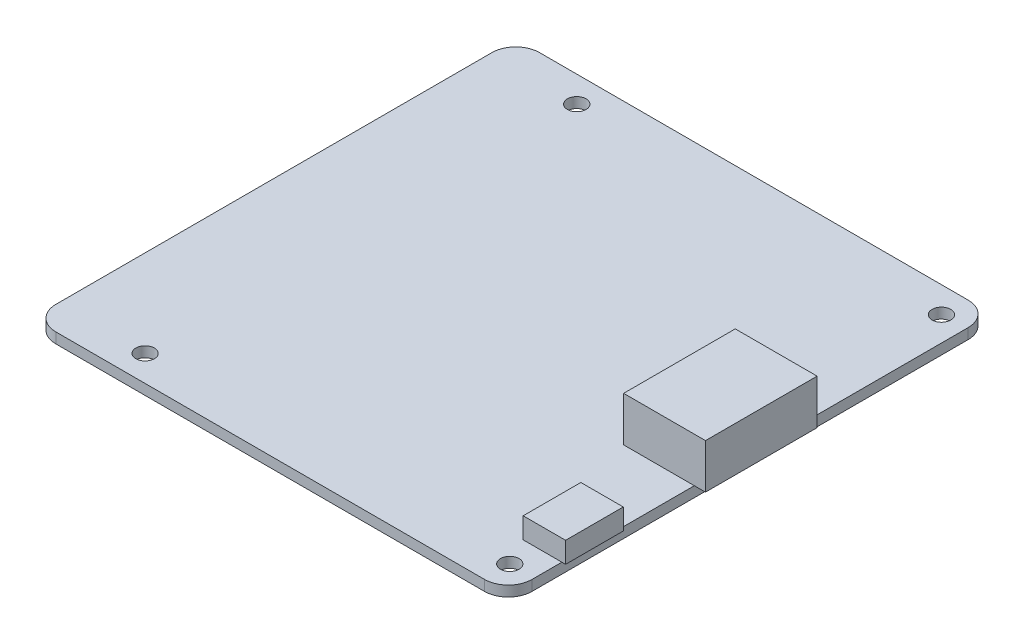
ISO-10303-21;
HEADER;
FILE_DESCRIPTION(('STEP AP214'),'2;1');
FILE_NAME('part.step','',(''),(''),'','','');
FILE_SCHEMA(('AUTOMOTIVE_DESIGN { 1 0 10303 214 1 1 1 1 }'));
ENDSEC;
DATA;
#1=APPLICATION_CONTEXT('core data for automotive mechanical design processes');
#2=APPLICATION_PROTOCOL_DEFINITION('international standard','automotive_design',2000,#1);
#3=PRODUCT_CONTEXT('',#1,'mechanical');
#4=PRODUCT('Part','Part','',(#3));
#5=PRODUCT_RELATED_PRODUCT_CATEGORY('part','',(#4));
#6=PRODUCT_DEFINITION_FORMATION('','',#4);
#7=PRODUCT_DEFINITION_CONTEXT('part definition',#1,'design');
#8=PRODUCT_DEFINITION('design','',#6,#7);
#9=PRODUCT_DEFINITION_SHAPE('','',#8);
#10=(LENGTH_UNIT() NAMED_UNIT(*) SI_UNIT(.MILLI.,.METRE.));
#11=(NAMED_UNIT(*) PLANE_ANGLE_UNIT() SI_UNIT($,.RADIAN.));
#12=(NAMED_UNIT(*) SI_UNIT($,.STERADIAN.) SOLID_ANGLE_UNIT());
#13=UNCERTAINTY_MEASURE_WITH_UNIT(LENGTH_MEASURE(1.E-05),#10,'distance_accuracy_value','');
#14=(GEOMETRIC_REPRESENTATION_CONTEXT(3) GLOBAL_UNCERTAINTY_ASSIGNED_CONTEXT((#13)) GLOBAL_UNIT_ASSIGNED_CONTEXT((#10,
#11,#12)) REPRESENTATION_CONTEXT('',''));
#15=CARTESIAN_POINT('',(0.,0.,0.));
#16=DIRECTION('',(0.,0.,1.));
#17=DIRECTION('',(1.,0.,0.));
#18=AXIS2_PLACEMENT_3D('',#15,#16,#17);
#19=CARTESIAN_POINT('',(0.,1.4,0.));
#20=DIRECTION('',(0.,-1.,0.));
#21=DIRECTION('',(0.,0.,-1.));
#22=AXIS2_PLACEMENT_3D('',#19,#20,#21);
#23=PLANE('',#22);
#24=CARTESIAN_POINT('',(28.7,1.4,29.));
#25=DIRECTION('',(0.,1.,0.));
#26=DIRECTION('',(0.,0.,1.));
#27=AXIS2_PLACEMENT_3D('',#24,#25,#26);
#28=CIRCLE('',#27,1.25);
#29=CARTESIAN_POINT('',(28.7,1.4,30.25));
#30=VERTEX_POINT('',#29);
#31=EDGE_CURVE('E251',#30,#30,#28,.T.);
#32=ORIENTED_EDGE('',*,*,#31,.F.);
#33=EDGE_LOOP('',(#32));
#34=FACE_BOUND('',#33,.T.);
#35=CARTESIAN_POINT('',(-20.3,1.4,29.));
#36=DIRECTION('',(0.,1.,0.));
#37=DIRECTION('',(0.,0.,1.));
#38=AXIS2_PLACEMENT_3D('',#35,#36,#37);
#39=CIRCLE('',#38,1.25);
#40=CARTESIAN_POINT('',(-20.3,1.4,30.25));
#41=VERTEX_POINT('',#40);
#42=EDGE_CURVE('E245',#41,#41,#39,.T.);
#43=ORIENTED_EDGE('',*,*,#42,.F.);
#44=EDGE_LOOP('',(#43));
#45=FACE_BOUND('',#44,.T.);
#46=CARTESIAN_POINT('',(-20.3,1.4,-29.));
#47=DIRECTION('',(0.,1.,0.));
#48=DIRECTION('',(0.,0.,1.));
#49=AXIS2_PLACEMENT_3D('',#46,#47,#48);
#50=CIRCLE('',#49,1.25);
#51=CARTESIAN_POINT('',(-20.3,1.4,-27.75));
#52=VERTEX_POINT('',#51);
#53=EDGE_CURVE('E239',#52,#52,#50,.T.);
#54=ORIENTED_EDGE('',*,*,#53,.F.);
#55=EDGE_LOOP('',(#54));
#56=FACE_BOUND('',#55,.T.);
#57=CARTESIAN_POINT('',(28.7,1.4,-29.));
#58=DIRECTION('',(0.,1.,0.));
#59=DIRECTION('',(0.,0.,1.));
#60=AXIS2_PLACEMENT_3D('',#57,#58,#59);
#61=CIRCLE('',#60,1.25);
#62=CARTESIAN_POINT('',(28.7,1.4,-27.75));
#63=VERTEX_POINT('',#62);
#64=EDGE_CURVE('E233',#63,#63,#61,.T.);
#65=ORIENTED_EDGE('',*,*,#64,.F.);
#66=EDGE_LOOP('',(#65));
#67=FACE_BOUND('',#66,.T.);
#68=DIRECTION('',(-1.,0.,0.));
#69=VECTOR('',#68,1.);
#70=CARTESIAN_POINT('',(-32.,1.4,-32.5));
#71=LINE('',#70,#69);
#72=CARTESIAN_POINT('',(28.8,1.4,-32.5));
#73=VERTEX_POINT('',#72);
#74=CARTESIAN_POINT('',(-28.8,1.4,-32.5));
#75=VERTEX_POINT('',#74);
#76=EDGE_CURVE('E259',#73,#75,#71,.T.);
#77=ORIENTED_EDGE('',*,*,#76,.T.);
#78=CARTESIAN_POINT('',(-28.8,1.4,-29.3));
#79=DIRECTION('',(0.,-1.,0.));
#80=DIRECTION('',(0.,0.,-1.));
#81=AXIS2_PLACEMENT_3D('',#78,#79,#80);
#82=CIRCLE('',#81,3.2);
#83=CARTESIAN_POINT('',(-32.,1.4,-29.3));
#84=VERTEX_POINT('',#83);
#85=EDGE_CURVE('E304',#75,#84,#82,.F.);
#86=ORIENTED_EDGE('',*,*,#85,.T.);
#87=DIRECTION('',(0.,0.,1.));
#88=VECTOR('',#87,1.);
#89=CARTESIAN_POINT('',(-32.,1.4,32.5));
#90=LINE('',#89,#88);
#91=CARTESIAN_POINT('',(-32.,1.4,29.3));
#92=VERTEX_POINT('',#91);
#93=EDGE_CURVE('E265',#84,#92,#90,.T.);
#94=ORIENTED_EDGE('',*,*,#93,.T.);
#95=CARTESIAN_POINT('',(-28.8,1.4,29.3));
#96=DIRECTION('',(0.,-1.,0.));
#97=DIRECTION('',(0.,0.,-1.));
#98=AXIS2_PLACEMENT_3D('',#95,#96,#97);
#99=CIRCLE('',#98,3.2);
#100=CARTESIAN_POINT('',(-28.8,1.4,32.5));
#101=VERTEX_POINT('',#100);
#102=EDGE_CURVE('E299',#92,#101,#99,.F.);
#103=ORIENTED_EDGE('',*,*,#102,.T.);
#104=DIRECTION('',(1.,0.,0.));
#105=VECTOR('',#104,1.);
#106=CARTESIAN_POINT('',(-32.,1.4,32.5));
#107=LINE('',#106,#105);
#108=CARTESIAN_POINT('',(28.8,1.4,32.5));
#109=VERTEX_POINT('',#108);
#110=EDGE_CURVE('E268',#101,#109,#107,.T.);
#111=ORIENTED_EDGE('',*,*,#110,.T.);
#112=CARTESIAN_POINT('',(28.8,1.4,29.3));
#113=DIRECTION('',(0.,-1.,0.));
#114=DIRECTION('',(0.,0.,-1.));
#115=AXIS2_PLACEMENT_3D('',#112,#113,#114);
#116=CIRCLE('',#115,3.2);
#117=CARTESIAN_POINT('',(32.,1.4,29.3));
#118=VERTEX_POINT('',#117);
#119=EDGE_CURVE('E55',#109,#118,#116,.F.);
#120=ORIENTED_EDGE('',*,*,#119,.T.);
#121=DIRECTION('',(0.,0.,-1.));
#122=VECTOR('',#121,1.);
#123=CARTESIAN_POINT('',(32.,1.4,32.5));
#124=LINE('',#123,#122);
#125=CARTESIAN_POINT('',(32.,1.4,25.3));
#126=VERTEX_POINT('',#125);
#127=EDGE_CURVE('E257',#118,#126,#124,.T.);
#128=ORIENTED_EDGE('',*,*,#127,.T.);
#129=DIRECTION('',(1.,0.,0.));
#130=VECTOR('',#129,1.);
#131=CARTESIAN_POINT('',(32.5,1.4,25.3));
#132=LINE('',#131,#130);
#133=CARTESIAN_POINT('',(26.8,1.4,25.3));
#134=VERTEX_POINT('',#133);
#135=EDGE_CURVE('E187',#134,#126,#132,.T.);
#136=ORIENTED_EDGE('',*,*,#135,.F.);
#137=DIRECTION('',(0.,0.,1.));
#138=VECTOR('',#137,1.);
#139=CARTESIAN_POINT('',(26.8,1.4,17.55));
#140=LINE('',#139,#138);
#141=CARTESIAN_POINT('',(26.8,1.4,17.55));
#142=VERTEX_POINT('',#141);
#143=EDGE_CURVE('E333',#142,#134,#140,.T.);
#144=ORIENTED_EDGE('',*,*,#143,.F.);
#145=DIRECTION('',(-1.,0.,0.));
#146=VECTOR('',#145,1.);
#147=CARTESIAN_POINT('',(32.5,1.4,17.55));
#148=LINE('',#147,#146);
#149=CARTESIAN_POINT('',(32.,1.4,17.55));
#150=VERTEX_POINT('',#149);
#151=EDGE_CURVE('E348',#150,#142,#148,.T.);
#152=ORIENTED_EDGE('',*,*,#151,.F.);
#153=CARTESIAN_POINT('',(32.,1.4,7.5));
#154=VERTEX_POINT('',#153);
#155=EDGE_CURVE('E261',#150,#154,#124,.T.);
#156=ORIENTED_EDGE('',*,*,#155,.T.);
#157=DIRECTION('',(1.,0.,0.));
#158=VECTOR('',#157,1.);
#159=CARTESIAN_POINT('',(33.5,1.4,7.5));
#160=LINE('',#159,#158);
#161=CARTESIAN_POINT('',(22.5,1.4,7.5));
#162=VERTEX_POINT('',#161);
#163=EDGE_CURVE('E205',#162,#154,#160,.T.);
#164=ORIENTED_EDGE('',*,*,#163,.F.);
#165=DIRECTION('',(0.,0.,1.));
#166=VECTOR('',#165,1.);
#167=CARTESIAN_POINT('',(22.5,1.4,-7.5));
#168=LINE('',#167,#166);
#169=CARTESIAN_POINT('',(22.5,1.4,-7.5));
#170=VERTEX_POINT('',#169);
#171=EDGE_CURVE('E214',#170,#162,#168,.T.);
#172=ORIENTED_EDGE('',*,*,#171,.F.);
#173=DIRECTION('',(-1.,0.,0.));
#174=VECTOR('',#173,1.);
#175=CARTESIAN_POINT('',(33.5,1.4,-7.5));
#176=LINE('',#175,#174);
#177=CARTESIAN_POINT('',(32.,1.4,-7.5));
#178=VERTEX_POINT('',#177);
#179=EDGE_CURVE('E215',#178,#170,#176,.T.);
#180=ORIENTED_EDGE('',*,*,#179,.F.);
#181=CARTESIAN_POINT('',(32.,1.4,-29.3));
#182=VERTEX_POINT('',#181);
#183=EDGE_CURVE('E280',#178,#182,#124,.T.);
#184=ORIENTED_EDGE('',*,*,#183,.T.);
#185=CARTESIAN_POINT('',(28.8,1.4,-29.3));
#186=DIRECTION('',(0.,-1.,0.));
#187=DIRECTION('',(0.,0.,-1.));
#188=AXIS2_PLACEMENT_3D('',#185,#186,#187);
#189=CIRCLE('',#188,3.2);
#190=EDGE_CURVE('E302',#182,#73,#189,.F.);
#191=ORIENTED_EDGE('',*,*,#190,.T.);
#192=EDGE_LOOP('',(#77,#86,#94,#103,#111,#120,#128,#136,#144,#152,#156,#164,#172,#180,#184,#191));
#193=FACE_BOUND('',#192,.T.);
#194=ADVANCED_FACE('F40',(#34,#45,#56,#67,#193),#23,.F.);
#195=CARTESIAN_POINT('',(0.,0.,0.));
#196=DIRECTION('',(0.,-1.,0.));
#197=DIRECTION('',(0.,0.,-1.));
#198=AXIS2_PLACEMENT_3D('',#195,#196,#197);
#199=PLANE('',#198);
#200=CARTESIAN_POINT('',(-20.3,0.,-29.));
#201=DIRECTION('',(0.,1.,0.));
#202=DIRECTION('',(0.,0.,1.));
#203=AXIS2_PLACEMENT_3D('',#200,#201,#202);
#204=CIRCLE('',#203,1.25);
#205=CARTESIAN_POINT('',(-20.3,0.,-27.75));
#206=VERTEX_POINT('',#205);
#207=EDGE_CURVE('E236',#206,#206,#204,.T.);
#208=ORIENTED_EDGE('',*,*,#207,.T.);
#209=EDGE_LOOP('',(#208));
#210=FACE_BOUND('',#209,.T.);
#211=CARTESIAN_POINT('',(28.7,0.,29.));
#212=DIRECTION('',(0.,1.,0.));
#213=DIRECTION('',(0.,0.,1.));
#214=AXIS2_PLACEMENT_3D('',#211,#212,#213);
#215=CIRCLE('',#214,1.25);
#216=CARTESIAN_POINT('',(28.7,0.,30.25));
#217=VERTEX_POINT('',#216);
#218=EDGE_CURVE('E248',#217,#217,#215,.T.);
#219=ORIENTED_EDGE('',*,*,#218,.T.);
#220=EDGE_LOOP('',(#219));
#221=FACE_BOUND('',#220,.T.);
#222=DIRECTION('',(0.,0.,1.));
#223=VECTOR('',#222,1.);
#224=CARTESIAN_POINT('',(-32.,0.,32.5));
#225=LINE('',#224,#223);
#226=CARTESIAN_POINT('',(-32.,0.,-29.3));
#227=VERTEX_POINT('',#226);
#228=CARTESIAN_POINT('',(-32.,0.,29.3));
#229=VERTEX_POINT('',#228);
#230=EDGE_CURVE('E275',#227,#229,#225,.T.);
#231=ORIENTED_EDGE('',*,*,#230,.F.);
#232=CARTESIAN_POINT('',(-28.8,0.,-29.3));
#233=DIRECTION('',(0.,-1.,0.));
#234=DIRECTION('',(0.,0.,-1.));
#235=AXIS2_PLACEMENT_3D('',#232,#233,#234);
#236=CIRCLE('',#235,3.2);
#237=CARTESIAN_POINT('',(-28.8,0.,-32.5));
#238=VERTEX_POINT('',#237);
#239=EDGE_CURVE('E292',#227,#238,#236,.T.);
#240=ORIENTED_EDGE('',*,*,#239,.T.);
#241=DIRECTION('',(-1.,0.,0.));
#242=VECTOR('',#241,1.);
#243=CARTESIAN_POINT('',(-32.,0.,-32.5));
#244=LINE('',#243,#242);
#245=CARTESIAN_POINT('',(28.8,0.,-32.5));
#246=VERTEX_POINT('',#245);
#247=EDGE_CURVE('E272',#246,#238,#244,.T.);
#248=ORIENTED_EDGE('',*,*,#247,.F.);
#249=CARTESIAN_POINT('',(28.8,0.,-29.3));
#250=DIRECTION('',(0.,-1.,0.));
#251=DIRECTION('',(0.,0.,-1.));
#252=AXIS2_PLACEMENT_3D('',#249,#250,#251);
#253=CIRCLE('',#252,3.2);
#254=CARTESIAN_POINT('',(32.,0.,-29.3));
#255=VERTEX_POINT('',#254);
#256=EDGE_CURVE('E290',#246,#255,#253,.T.);
#257=ORIENTED_EDGE('',*,*,#256,.T.);
#258=DIRECTION('',(0.,0.,-1.));
#259=VECTOR('',#258,1.);
#260=CARTESIAN_POINT('',(32.,0.,32.5));
#261=LINE('',#260,#259);
#262=CARTESIAN_POINT('',(32.,0.,29.3));
#263=VERTEX_POINT('',#262);
#264=EDGE_CURVE('E254',#263,#255,#261,.T.);
#265=ORIENTED_EDGE('',*,*,#264,.F.);
#266=CARTESIAN_POINT('',(28.8,0.,29.3));
#267=DIRECTION('',(0.,-1.,0.));
#268=DIRECTION('',(0.,0.,-1.));
#269=AXIS2_PLACEMENT_3D('',#266,#267,#268);
#270=CIRCLE('',#269,3.2);
#271=CARTESIAN_POINT('',(28.8,0.,32.5));
#272=VERTEX_POINT('',#271);
#273=EDGE_CURVE('E288',#263,#272,#270,.T.);
#274=ORIENTED_EDGE('',*,*,#273,.T.);
#275=DIRECTION('',(1.,0.,0.));
#276=VECTOR('',#275,1.);
#277=CARTESIAN_POINT('',(-32.,0.,32.5));
#278=LINE('',#277,#276);
#279=CARTESIAN_POINT('',(-28.8,0.,32.5));
#280=VERTEX_POINT('',#279);
#281=EDGE_CURVE('E278',#280,#272,#278,.T.);
#282=ORIENTED_EDGE('',*,*,#281,.F.);
#283=CARTESIAN_POINT('',(-28.8,0.,29.3));
#284=DIRECTION('',(0.,-1.,0.));
#285=DIRECTION('',(0.,0.,-1.));
#286=AXIS2_PLACEMENT_3D('',#283,#284,#285);
#287=CIRCLE('',#286,3.2);
#288=EDGE_CURVE('E286',#280,#229,#287,.T.);
#289=ORIENTED_EDGE('',*,*,#288,.T.);
#290=EDGE_LOOP('',(#231,#240,#248,#257,#265,#274,#282,#289));
#291=FACE_BOUND('',#290,.T.);
#292=CARTESIAN_POINT('',(-20.3,0.,29.));
#293=DIRECTION('',(0.,1.,0.));
#294=DIRECTION('',(0.,0.,1.));
#295=AXIS2_PLACEMENT_3D('',#292,#293,#294);
#296=CIRCLE('',#295,1.25);
#297=CARTESIAN_POINT('',(-20.3,0.,30.25));
#298=VERTEX_POINT('',#297);
#299=EDGE_CURVE('E242',#298,#298,#296,.T.);
#300=ORIENTED_EDGE('',*,*,#299,.T.);
#301=EDGE_LOOP('',(#300));
#302=FACE_BOUND('',#301,.T.);
#303=CARTESIAN_POINT('',(28.7,0.,-29.));
#304=DIRECTION('',(0.,1.,0.));
#305=DIRECTION('',(0.,0.,1.));
#306=AXIS2_PLACEMENT_3D('',#303,#304,#305);
#307=CIRCLE('',#306,1.25);
#308=CARTESIAN_POINT('',(28.7,0.,-27.75));
#309=VERTEX_POINT('',#308);
#310=EDGE_CURVE('E232',#309,#309,#307,.T.);
#311=ORIENTED_EDGE('',*,*,#310,.T.);
#312=EDGE_LOOP('',(#311));
#313=FACE_BOUND('',#312,.T.);
#314=ADVANCED_FACE('F318',(#210,#221,#291,#302,#313),#199,.T.);
#315=CARTESIAN_POINT('',(32.,1.4,32.5));
#316=DIRECTION('',(-1.,0.,0.));
#317=DIRECTION('',(0.,0.,1.));
#318=AXIS2_PLACEMENT_3D('',#315,#316,#317);
#319=PLANE('',#318);
#320=ORIENTED_EDGE('',*,*,#264,.T.);
#321=DIRECTION('',(0.,-1.,0.));
#322=VECTOR('',#321,1.);
#323=CARTESIAN_POINT('',(32.,1.4,-29.3));
#324=LINE('',#323,#322);
#325=EDGE_CURVE('E309',#255,#182,#324,.F.);
#326=ORIENTED_EDGE('',*,*,#325,.T.);
#327=ORIENTED_EDGE('',*,*,#183,.F.);
#328=EDGE_CURVE('E262',#154,#178,#124,.T.);
#329=ORIENTED_EDGE('',*,*,#328,.F.);
#330=ORIENTED_EDGE('',*,*,#155,.F.);
#331=EDGE_CURVE('E260',#126,#150,#124,.T.);
#332=ORIENTED_EDGE('',*,*,#331,.F.);
#333=ORIENTED_EDGE('',*,*,#127,.F.);
#334=DIRECTION('',(0.,-1.,0.));
#335=VECTOR('',#334,1.);
#336=CARTESIAN_POINT('',(32.,1.4,29.3));
#337=LINE('',#336,#335);
#338=EDGE_CURVE('E306',#118,#263,#337,.T.);
#339=ORIENTED_EDGE('',*,*,#338,.T.);
#340=EDGE_LOOP('',(#320,#326,#327,#329,#330,#332,#333,#339));
#341=FACE_BOUND('',#340,.T.);
#342=ADVANCED_FACE('F325',(#341),#319,.F.);
#343=CARTESIAN_POINT('',(-32.,1.4,-32.5));
#344=DIRECTION('',(0.,0.,1.));
#345=DIRECTION('',(1.,0.,0.));
#346=AXIS2_PLACEMENT_3D('',#343,#344,#345);
#347=PLANE('',#346);
#348=ORIENTED_EDGE('',*,*,#247,.T.);
#349=DIRECTION('',(0.,-1.,0.));
#350=VECTOR('',#349,1.);
#351=CARTESIAN_POINT('',(-28.8,1.4,-32.5));
#352=LINE('',#351,#350);
#353=EDGE_CURVE('E297',#238,#75,#352,.F.);
#354=ORIENTED_EDGE('',*,*,#353,.T.);
#355=ORIENTED_EDGE('',*,*,#76,.F.);
#356=DIRECTION('',(0.,-1.,0.));
#357=VECTOR('',#356,1.);
#358=CARTESIAN_POINT('',(28.8,1.4,-32.5));
#359=LINE('',#358,#357);
#360=EDGE_CURVE('E294',#73,#246,#359,.T.);
#361=ORIENTED_EDGE('',*,*,#360,.T.);
#362=EDGE_LOOP('',(#348,#354,#355,#361));
#363=FACE_BOUND('',#362,.T.);
#364=ADVANCED_FACE('F408',(#363),#347,.F.);
#365=CARTESIAN_POINT('',(-32.,1.4,32.5));
#366=DIRECTION('',(1.,0.,0.));
#367=DIRECTION('',(0.,0.,-1.));
#368=AXIS2_PLACEMENT_3D('',#365,#366,#367);
#369=PLANE('',#368);
#370=ORIENTED_EDGE('',*,*,#93,.F.);
#371=DIRECTION('',(0.,-1.,0.));
#372=VECTOR('',#371,1.);
#373=CARTESIAN_POINT('',(-32.,1.4,-29.3));
#374=LINE('',#373,#372);
#375=EDGE_CURVE('E283',#84,#227,#374,.T.);
#376=ORIENTED_EDGE('',*,*,#375,.T.);
#377=ORIENTED_EDGE('',*,*,#230,.T.);
#378=DIRECTION('',(0.,-1.,0.));
#379=VECTOR('',#378,1.);
#380=CARTESIAN_POINT('',(-32.,1.4,29.3));
#381=LINE('',#380,#379);
#382=EDGE_CURVE('E281',#229,#92,#381,.F.);
#383=ORIENTED_EDGE('',*,*,#382,.T.);
#384=EDGE_LOOP('',(#370,#376,#377,#383));
#385=FACE_BOUND('',#384,.T.);
#386=ADVANCED_FACE('F405',(#385),#369,.F.);
#387=CARTESIAN_POINT('',(-32.,1.4,32.5));
#388=DIRECTION('',(0.,0.,-1.));
#389=DIRECTION('',(-1.,0.,0.));
#390=AXIS2_PLACEMENT_3D('',#387,#388,#389);
#391=PLANE('',#390);
#392=ORIENTED_EDGE('',*,*,#281,.T.);
#393=DIRECTION('',(0.,-1.,0.));
#394=VECTOR('',#393,1.);
#395=CARTESIAN_POINT('',(28.8,1.4,32.5));
#396=LINE('',#395,#394);
#397=EDGE_CURVE('E11',#272,#109,#396,.F.);
#398=ORIENTED_EDGE('',*,*,#397,.T.);
#399=ORIENTED_EDGE('',*,*,#110,.F.);
#400=DIRECTION('',(0.,-1.,0.));
#401=VECTOR('',#400,1.);
#402=CARTESIAN_POINT('',(-28.8,1.4,32.5));
#403=LINE('',#402,#401);
#404=EDGE_CURVE('E48',#101,#280,#403,.T.);
#405=ORIENTED_EDGE('',*,*,#404,.T.);
#406=EDGE_LOOP('',(#392,#398,#399,#405));
#407=FACE_BOUND('',#406,.T.);
#408=ADVANCED_FACE('F313',(#407),#391,.F.);
#409=CARTESIAN_POINT('',(28.7,1.4,29.));
#410=DIRECTION('',(0.,-1.,0.));
#411=DIRECTION('',(0.,0.,-1.));
#412=AXIS2_PLACEMENT_3D('',#409,#410,#411);
#413=CYLINDRICAL_SURFACE('',#412,1.25);
#414=ORIENTED_EDGE('',*,*,#31,.T.);
#415=EDGE_LOOP('',(#414));
#416=FACE_BOUND('',#415,.T.);
#417=ORIENTED_EDGE('',*,*,#218,.F.);
#418=EDGE_LOOP('',(#417));
#419=FACE_BOUND('',#418,.T.);
#420=ADVANCED_FACE('F400',(#416,#419),#413,.F.);
#421=CARTESIAN_POINT('',(-20.3,1.4,29.));
#422=DIRECTION('',(0.,-1.,0.));
#423=DIRECTION('',(0.,0.,-1.));
#424=AXIS2_PLACEMENT_3D('',#421,#422,#423);
#425=CYLINDRICAL_SURFACE('',#424,1.25);
#426=ORIENTED_EDGE('',*,*,#42,.T.);
#427=EDGE_LOOP('',(#426));
#428=FACE_BOUND('',#427,.T.);
#429=ORIENTED_EDGE('',*,*,#299,.F.);
#430=EDGE_LOOP('',(#429));
#431=FACE_BOUND('',#430,.T.);
#432=ADVANCED_FACE('F460',(#428,#431),#425,.F.);
#433=CARTESIAN_POINT('',(-20.3,1.4,-29.));
#434=DIRECTION('',(0.,-1.,0.));
#435=DIRECTION('',(0.,0.,-1.));
#436=AXIS2_PLACEMENT_3D('',#433,#434,#435);
#437=CYLINDRICAL_SURFACE('',#436,1.25);
#438=ORIENTED_EDGE('',*,*,#53,.T.);
#439=EDGE_LOOP('',(#438));
#440=FACE_BOUND('',#439,.T.);
#441=ORIENTED_EDGE('',*,*,#207,.F.);
#442=EDGE_LOOP('',(#441));
#443=FACE_BOUND('',#442,.T.);
#444=ADVANCED_FACE('F454',(#440,#443),#437,.F.);
#445=CARTESIAN_POINT('',(28.7,1.4,-29.));
#446=DIRECTION('',(0.,-1.,0.));
#447=DIRECTION('',(0.,0.,-1.));
#448=AXIS2_PLACEMENT_3D('',#445,#446,#447);
#449=CYLINDRICAL_SURFACE('',#448,1.25);
#450=ORIENTED_EDGE('',*,*,#64,.T.);
#451=EDGE_LOOP('',(#450));
#452=FACE_BOUND('',#451,.T.);
#453=ORIENTED_EDGE('',*,*,#310,.F.);
#454=EDGE_LOOP('',(#453));
#455=FACE_BOUND('',#454,.T.);
#456=ADVANCED_FACE('F459',(#452,#455),#449,.F.);
#457=CARTESIAN_POINT('',(33.5,7.4,-7.5));
#458=DIRECTION('',(-1.,0.,0.));
#459=DIRECTION('',(0.,0.,1.));
#460=AXIS2_PLACEMENT_3D('',#457,#458,#459);
#461=PLANE('',#460);
#462=DIRECTION('',(0.,0.,-1.));
#463=VECTOR('',#462,1.);
#464=CARTESIAN_POINT('',(33.5,1.4,-7.5));
#465=LINE('',#464,#463);
#466=CARTESIAN_POINT('',(33.5,1.4,7.5));
#467=VERTEX_POINT('',#466);
#468=CARTESIAN_POINT('',(33.5,1.4,-7.5));
#469=VERTEX_POINT('',#468);
#470=EDGE_CURVE('E192',#467,#469,#465,.T.);
#471=ORIENTED_EDGE('',*,*,#470,.T.);
#472=DIRECTION('',(0.,-1.,0.));
#473=VECTOR('',#472,1.);
#474=CARTESIAN_POINT('',(33.5,7.4,-7.5));
#475=LINE('',#474,#473);
#476=CARTESIAN_POINT('',(33.5,7.4,-7.5));
#477=VERTEX_POINT('',#476);
#478=EDGE_CURVE('E229',#477,#469,#475,.T.);
#479=ORIENTED_EDGE('',*,*,#478,.F.);
#480=DIRECTION('',(0.,0.,-1.));
#481=VECTOR('',#480,1.);
#482=CARTESIAN_POINT('',(33.5,7.4,-7.5));
#483=LINE('',#482,#481);
#484=CARTESIAN_POINT('',(33.5,7.4,7.5));
#485=VERTEX_POINT('',#484);
#486=EDGE_CURVE('E201',#485,#477,#483,.T.);
#487=ORIENTED_EDGE('',*,*,#486,.F.);
#488=DIRECTION('',(0.,-1.,0.));
#489=VECTOR('',#488,1.);
#490=CARTESIAN_POINT('',(33.5,7.4,7.5));
#491=LINE('',#490,#489);
#492=EDGE_CURVE('E210',#485,#467,#491,.T.);
#493=ORIENTED_EDGE('',*,*,#492,.T.);
#494=EDGE_LOOP('',(#471,#479,#487,#493));
#495=FACE_BOUND('',#494,.T.);
#496=ADVANCED_FACE('F369',(#495),#461,.F.);
#497=CARTESIAN_POINT('',(33.5,7.4,-7.5));
#498=DIRECTION('',(0.,0.,1.));
#499=DIRECTION('',(1.,0.,0.));
#500=AXIS2_PLACEMENT_3D('',#497,#498,#499);
#501=PLANE('',#500);
#502=EDGE_CURVE('E195',#469,#178,#176,.T.);
#503=ORIENTED_EDGE('',*,*,#502,.T.);
#504=ORIENTED_EDGE('',*,*,#179,.T.);
#505=DIRECTION('',(0.,-1.,0.));
#506=VECTOR('',#505,1.);
#507=CARTESIAN_POINT('',(22.5,7.4,-7.5));
#508=LINE('',#507,#506);
#509=CARTESIAN_POINT('',(22.5,7.4,-7.5));
#510=VERTEX_POINT('',#509);
#511=EDGE_CURVE('E226',#510,#170,#508,.T.);
#512=ORIENTED_EDGE('',*,*,#511,.F.);
#513=DIRECTION('',(-1.,0.,0.));
#514=VECTOR('',#513,1.);
#515=CARTESIAN_POINT('',(33.5,7.4,-7.5));
#516=LINE('',#515,#514);
#517=EDGE_CURVE('E204',#477,#510,#516,.T.);
#518=ORIENTED_EDGE('',*,*,#517,.F.);
#519=ORIENTED_EDGE('',*,*,#478,.T.);
#520=EDGE_LOOP('',(#503,#504,#512,#518,#519));
#521=FACE_BOUND('',#520,.T.);
#522=ADVANCED_FACE('F364',(#521),#501,.F.);
#523=CARTESIAN_POINT('',(22.5,7.4,-7.5));
#524=DIRECTION('',(1.,0.,0.));
#525=DIRECTION('',(0.,0.,-1.));
#526=AXIS2_PLACEMENT_3D('',#523,#524,#525);
#527=PLANE('',#526);
#528=ORIENTED_EDGE('',*,*,#171,.T.);
#529=DIRECTION('',(0.,-1.,0.));
#530=VECTOR('',#529,1.);
#531=CARTESIAN_POINT('',(22.5,7.4,7.5));
#532=LINE('',#531,#530);
#533=CARTESIAN_POINT('',(22.5,7.4,7.5));
#534=VERTEX_POINT('',#533);
#535=EDGE_CURVE('E223',#534,#162,#532,.T.);
#536=ORIENTED_EDGE('',*,*,#535,.F.);
#537=DIRECTION('',(0.,0.,1.));
#538=VECTOR('',#537,1.);
#539=CARTESIAN_POINT('',(22.5,7.4,-7.5));
#540=LINE('',#539,#538);
#541=EDGE_CURVE('E207',#510,#534,#540,.T.);
#542=ORIENTED_EDGE('',*,*,#541,.F.);
#543=ORIENTED_EDGE('',*,*,#511,.T.);
#544=EDGE_LOOP('',(#528,#536,#542,#543));
#545=FACE_BOUND('',#544,.T.);
#546=ADVANCED_FACE('F376',(#545),#527,.F.);
#547=CARTESIAN_POINT('',(33.5,7.4,7.5));
#548=DIRECTION('',(0.,0.,-1.));
#549=DIRECTION('',(-1.,0.,0.));
#550=AXIS2_PLACEMENT_3D('',#547,#548,#549);
#551=PLANE('',#550);
#552=ORIENTED_EDGE('',*,*,#163,.T.);
#553=EDGE_CURVE('E218',#154,#467,#160,.T.);
#554=ORIENTED_EDGE('',*,*,#553,.T.);
#555=ORIENTED_EDGE('',*,*,#492,.F.);
#556=DIRECTION('',(1.,0.,0.));
#557=VECTOR('',#556,1.);
#558=CARTESIAN_POINT('',(33.5,7.4,7.5));
#559=LINE('',#558,#557);
#560=EDGE_CURVE('E209',#534,#485,#559,.T.);
#561=ORIENTED_EDGE('',*,*,#560,.F.);
#562=ORIENTED_EDGE('',*,*,#535,.T.);
#563=EDGE_LOOP('',(#552,#554,#555,#561,#562));
#564=FACE_BOUND('',#563,.T.);
#565=ADVANCED_FACE('F373',(#564),#551,.F.);
#566=CARTESIAN_POINT('',(0.,7.4,0.));
#567=DIRECTION('',(0.,-1.,0.));
#568=DIRECTION('',(0.,0.,-1.));
#569=AXIS2_PLACEMENT_3D('',#566,#567,#568);
#570=PLANE('',#569);
#571=ORIENTED_EDGE('',*,*,#486,.T.);
#572=ORIENTED_EDGE('',*,*,#517,.T.);
#573=ORIENTED_EDGE('',*,*,#541,.T.);
#574=ORIENTED_EDGE('',*,*,#560,.T.);
#575=EDGE_LOOP('',(#571,#572,#573,#574));
#576=FACE_BOUND('',#575,.T.);
#577=ADVANCED_FACE('F379',(#576),#570,.F.);
#578=CARTESIAN_POINT('',(0.,1.4,0.));
#579=DIRECTION('',(0.,-1.,0.));
#580=DIRECTION('',(0.,0.,-1.));
#581=AXIS2_PLACEMENT_3D('',#578,#579,#580);
#582=PLANE('',#581);
#583=ORIENTED_EDGE('',*,*,#553,.F.);
#584=ORIENTED_EDGE('',*,*,#328,.T.);
#585=ORIENTED_EDGE('',*,*,#502,.F.);
#586=ORIENTED_EDGE('',*,*,#470,.F.);
#587=EDGE_LOOP('',(#583,#584,#585,#586));
#588=FACE_BOUND('',#587,.T.);
#589=ADVANCED_FACE('F360',(#588),#582,.T.);
#590=CARTESIAN_POINT('',(0.,1.4,0.));
#591=DIRECTION('',(0.,-1.,0.));
#592=DIRECTION('',(0.,0.,-1.));
#593=AXIS2_PLACEMENT_3D('',#590,#591,#592);
#594=PLANE('',#593);
#595=ORIENTED_EDGE('',*,*,#331,.T.);
#596=CARTESIAN_POINT('',(32.5,1.4,17.55));
#597=VERTEX_POINT('',#596);
#598=EDGE_CURVE('E341',#597,#150,#148,.T.);
#599=ORIENTED_EDGE('',*,*,#598,.F.);
#600=DIRECTION('',(0.,0.,-1.));
#601=VECTOR('',#600,1.);
#602=CARTESIAN_POINT('',(32.5,1.4,17.55));
#603=LINE('',#602,#601);
#604=CARTESIAN_POINT('',(32.5,1.4,25.3));
#605=VERTEX_POINT('',#604);
#606=EDGE_CURVE('E191',#605,#597,#603,.T.);
#607=ORIENTED_EDGE('',*,*,#606,.F.);
#608=EDGE_CURVE('E336',#126,#605,#132,.T.);
#609=ORIENTED_EDGE('',*,*,#608,.F.);
#610=EDGE_LOOP('',(#595,#599,#607,#609));
#611=FACE_BOUND('',#610,.T.);
#612=ADVANCED_FACE('F353',(#611),#594,.T.);
#613=CARTESIAN_POINT('',(32.5,4.2,17.55));
#614=DIRECTION('',(-1.,0.,0.));
#615=DIRECTION('',(0.,0.,1.));
#616=AXIS2_PLACEMENT_3D('',#613,#614,#615);
#617=PLANE('',#616);
#618=ORIENTED_EDGE('',*,*,#606,.T.);
#619=DIRECTION('',(0.,-1.,0.));
#620=VECTOR('',#619,1.);
#621=CARTESIAN_POINT('',(32.5,4.2,17.55));
#622=LINE('',#621,#620);
#623=CARTESIAN_POINT('',(32.5,4.2,17.55));
#624=VERTEX_POINT('',#623);
#625=EDGE_CURVE('E170',#624,#597,#622,.T.);
#626=ORIENTED_EDGE('',*,*,#625,.F.);
#627=DIRECTION('',(0.,0.,-1.));
#628=VECTOR('',#627,1.);
#629=CARTESIAN_POINT('',(32.5,4.2,17.55));
#630=LINE('',#629,#628);
#631=CARTESIAN_POINT('',(32.5,4.2,25.3));
#632=VERTEX_POINT('',#631);
#633=EDGE_CURVE('E178',#632,#624,#630,.T.);
#634=ORIENTED_EDGE('',*,*,#633,.F.);
#635=DIRECTION('',(0.,-1.,0.));
#636=VECTOR('',#635,1.);
#637=CARTESIAN_POINT('',(32.5,4.2,25.3));
#638=LINE('',#637,#636);
#639=EDGE_CURVE('E344',#632,#605,#638,.T.);
#640=ORIENTED_EDGE('',*,*,#639,.T.);
#641=EDGE_LOOP('',(#618,#626,#634,#640));
#642=FACE_BOUND('',#641,.T.);
#643=ADVANCED_FACE('F189',(#642),#617,.F.);
#644=CARTESIAN_POINT('',(32.5,4.2,17.55));
#645=DIRECTION('',(0.,0.,1.));
#646=DIRECTION('',(1.,0.,0.));
#647=AXIS2_PLACEMENT_3D('',#644,#645,#646);
#648=PLANE('',#647);
#649=ORIENTED_EDGE('',*,*,#598,.T.);
#650=ORIENTED_EDGE('',*,*,#151,.T.);
#651=DIRECTION('',(0.,-1.,0.));
#652=VECTOR('',#651,1.);
#653=CARTESIAN_POINT('',(26.8,4.2,17.55));
#654=LINE('',#653,#652);
#655=CARTESIAN_POINT('',(26.8,4.2,17.55));
#656=VERTEX_POINT('',#655);
#657=EDGE_CURVE('E174',#656,#142,#654,.T.);
#658=ORIENTED_EDGE('',*,*,#657,.F.);
#659=DIRECTION('',(-1.,0.,0.));
#660=VECTOR('',#659,1.);
#661=CARTESIAN_POINT('',(32.5,4.2,17.55));
#662=LINE('',#661,#660);
#663=EDGE_CURVE('E165',#624,#656,#662,.T.);
#664=ORIENTED_EDGE('',*,*,#663,.F.);
#665=ORIENTED_EDGE('',*,*,#625,.T.);
#666=EDGE_LOOP('',(#649,#650,#658,#664,#665));
#667=FACE_BOUND('',#666,.T.);
#668=ADVANCED_FACE('F168',(#667),#648,.F.);
#669=CARTESIAN_POINT('',(26.8,4.2,17.55));
#670=DIRECTION('',(1.,0.,0.));
#671=DIRECTION('',(0.,0.,-1.));
#672=AXIS2_PLACEMENT_3D('',#669,#670,#671);
#673=PLANE('',#672);
#674=ORIENTED_EDGE('',*,*,#143,.T.);
#675=DIRECTION('',(0.,-1.,0.));
#676=VECTOR('',#675,1.);
#677=CARTESIAN_POINT('',(26.8,4.2,25.3));
#678=LINE('',#677,#676);
#679=CARTESIAN_POINT('',(26.8,4.2,25.3));
#680=VERTEX_POINT('',#679);
#681=EDGE_CURVE('E197',#680,#134,#678,.T.);
#682=ORIENTED_EDGE('',*,*,#681,.F.);
#683=DIRECTION('',(0.,0.,1.));
#684=VECTOR('',#683,1.);
#685=CARTESIAN_POINT('',(26.8,4.2,17.55));
#686=LINE('',#685,#684);
#687=EDGE_CURVE('E177',#656,#680,#686,.T.);
#688=ORIENTED_EDGE('',*,*,#687,.F.);
#689=ORIENTED_EDGE('',*,*,#657,.T.);
#690=EDGE_LOOP('',(#674,#682,#688,#689));
#691=FACE_BOUND('',#690,.T.);
#692=ADVANCED_FACE('F340',(#691),#673,.F.);
#693=CARTESIAN_POINT('',(32.5,4.2,25.3));
#694=DIRECTION('',(0.,0.,-1.));
#695=DIRECTION('',(-1.,0.,0.));
#696=AXIS2_PLACEMENT_3D('',#693,#694,#695);
#697=PLANE('',#696);
#698=ORIENTED_EDGE('',*,*,#135,.T.);
#699=ORIENTED_EDGE('',*,*,#608,.T.);
#700=ORIENTED_EDGE('',*,*,#639,.F.);
#701=DIRECTION('',(1.,0.,0.));
#702=VECTOR('',#701,1.);
#703=CARTESIAN_POINT('',(32.5,4.2,25.3));
#704=LINE('',#703,#702);
#705=EDGE_CURVE('E183',#680,#632,#704,.T.);
#706=ORIENTED_EDGE('',*,*,#705,.F.);
#707=ORIENTED_EDGE('',*,*,#681,.T.);
#708=EDGE_LOOP('',(#698,#699,#700,#706,#707));
#709=FACE_BOUND('',#708,.T.);
#710=ADVANCED_FACE('F343',(#709),#697,.F.);
#711=CARTESIAN_POINT('',(0.,4.2,0.));
#712=DIRECTION('',(0.,-1.,0.));
#713=DIRECTION('',(0.,0.,-1.));
#714=AXIS2_PLACEMENT_3D('',#711,#712,#713);
#715=PLANE('',#714);
#716=ORIENTED_EDGE('',*,*,#633,.T.);
#717=ORIENTED_EDGE('',*,*,#663,.T.);
#718=ORIENTED_EDGE('',*,*,#687,.T.);
#719=ORIENTED_EDGE('',*,*,#705,.T.);
#720=EDGE_LOOP('',(#716,#717,#718,#719));
#721=FACE_BOUND('',#720,.T.);
#722=ADVANCED_FACE('F181',(#721),#715,.F.);
#723=CARTESIAN_POINT('',(-28.8,1.4,-29.3));
#724=DIRECTION('',(0.,-1.,0.));
#725=DIRECTION('',(0.,0.,-1.));
#726=AXIS2_PLACEMENT_3D('',#723,#724,#725);
#727=CYLINDRICAL_SURFACE('',#726,3.2);
#728=ORIENTED_EDGE('',*,*,#85,.F.);
#729=ORIENTED_EDGE('',*,*,#353,.F.);
#730=ORIENTED_EDGE('',*,*,#239,.F.);
#731=ORIENTED_EDGE('',*,*,#375,.F.);
#732=EDGE_LOOP('',(#728,#729,#730,#731));
#733=FACE_BOUND('',#732,.T.);
#734=ADVANCED_FACE('F415',(#733),#727,.T.);
#735=CARTESIAN_POINT('',(28.8,1.4,-29.3));
#736=DIRECTION('',(0.,-1.,0.));
#737=DIRECTION('',(0.,0.,-1.));
#738=AXIS2_PLACEMENT_3D('',#735,#736,#737);
#739=CYLINDRICAL_SURFACE('',#738,3.2);
#740=ORIENTED_EDGE('',*,*,#190,.F.);
#741=ORIENTED_EDGE('',*,*,#325,.F.);
#742=ORIENTED_EDGE('',*,*,#256,.F.);
#743=ORIENTED_EDGE('',*,*,#360,.F.);
#744=EDGE_LOOP('',(#740,#741,#742,#743));
#745=FACE_BOUND('',#744,.T.);
#746=ADVANCED_FACE('F418',(#745),#739,.T.);
#747=CARTESIAN_POINT('',(28.8,1.4,29.3));
#748=DIRECTION('',(0.,-1.,0.));
#749=DIRECTION('',(0.,0.,-1.));
#750=AXIS2_PLACEMENT_3D('',#747,#748,#749);
#751=CYLINDRICAL_SURFACE('',#750,3.2);
#752=ORIENTED_EDGE('',*,*,#119,.F.);
#753=ORIENTED_EDGE('',*,*,#397,.F.);
#754=ORIENTED_EDGE('',*,*,#273,.F.);
#755=ORIENTED_EDGE('',*,*,#338,.F.);
#756=EDGE_LOOP('',(#752,#753,#754,#755));
#757=FACE_BOUND('',#756,.T.);
#758=ADVANCED_FACE('F323',(#757),#751,.T.);
#759=CARTESIAN_POINT('',(-28.8,1.4,29.3));
#760=DIRECTION('',(0.,-1.,0.));
#761=DIRECTION('',(0.,0.,-1.));
#762=AXIS2_PLACEMENT_3D('',#759,#760,#761);
#763=CYLINDRICAL_SURFACE('',#762,3.2);
#764=ORIENTED_EDGE('',*,*,#102,.F.);
#765=ORIENTED_EDGE('',*,*,#382,.F.);
#766=ORIENTED_EDGE('',*,*,#288,.F.);
#767=ORIENTED_EDGE('',*,*,#404,.F.);
#768=EDGE_LOOP('',(#764,#765,#766,#767));
#769=FACE_BOUND('',#768,.T.);
#770=ADVANCED_FACE('F42',(#769),#763,.T.);
#771=CLOSED_SHELL('',(#194,#314,#342,#364,#386,#408,#420,#432,#444,#456,#496,#522,#546,#565,
#577,#589,#612,#643,#668,#692,#710,#722,#734,#746,#758,#770));
#772=MANIFOLD_SOLID_BREP('B2',#771);
#773=ADVANCED_BREP_SHAPE_REPRESENTATION('',(#18,#772),#14);
#774=SHAPE_DEFINITION_REPRESENTATION(#9,#773);
ENDSEC;
END-ISO-10303-21;
